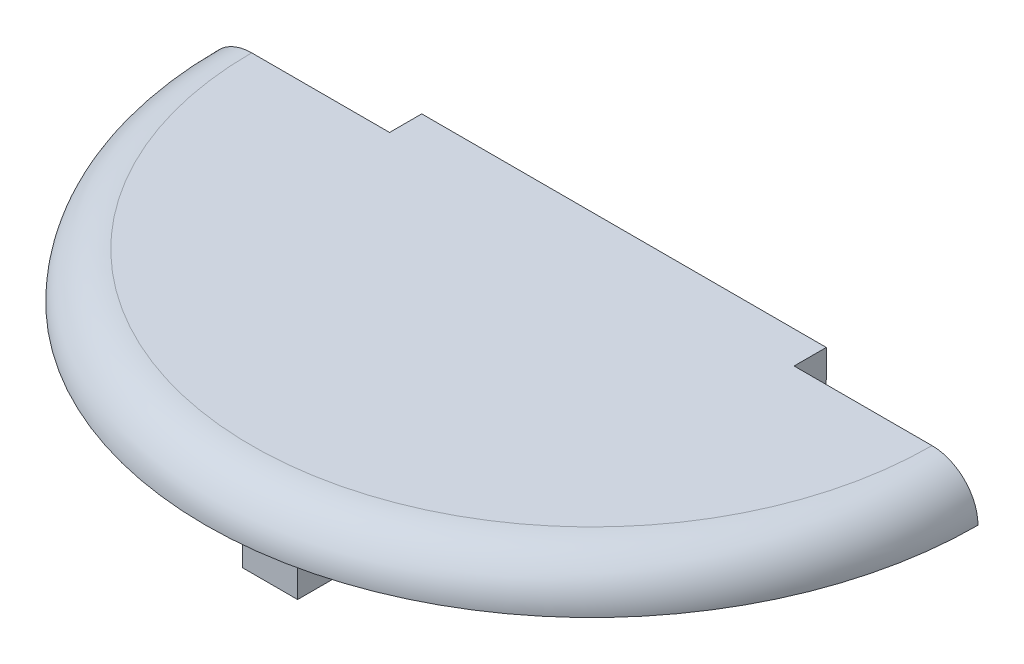
ISO-10303-21;
HEADER;
FILE_DESCRIPTION(('STEP AP214'),'2;1');
FILE_NAME('part.step','',(''),(''),'','','');
FILE_SCHEMA(('AUTOMOTIVE_DESIGN { 1 0 10303 214 1 1 1 1 }'));
ENDSEC;
DATA;
#1=APPLICATION_CONTEXT('core data for automotive mechanical design processes');
#2=APPLICATION_PROTOCOL_DEFINITION('international standard','automotive_design',2000,#1);
#3=PRODUCT_CONTEXT('',#1,'mechanical');
#4=PRODUCT('Part','Part','',(#3));
#5=PRODUCT_RELATED_PRODUCT_CATEGORY('part','',(#4));
#6=PRODUCT_DEFINITION_FORMATION('','',#4);
#7=PRODUCT_DEFINITION_CONTEXT('part definition',#1,'design');
#8=PRODUCT_DEFINITION('design','',#6,#7);
#9=PRODUCT_DEFINITION_SHAPE('','',#8);
#10=(LENGTH_UNIT() NAMED_UNIT(*) SI_UNIT(.MILLI.,.METRE.));
#11=(NAMED_UNIT(*) PLANE_ANGLE_UNIT() SI_UNIT($,.RADIAN.));
#12=(NAMED_UNIT(*) SI_UNIT($,.STERADIAN.) SOLID_ANGLE_UNIT());
#13=UNCERTAINTY_MEASURE_WITH_UNIT(LENGTH_MEASURE(1.E-05),#10,'distance_accuracy_value','');
#14=(GEOMETRIC_REPRESENTATION_CONTEXT(3) GLOBAL_UNCERTAINTY_ASSIGNED_CONTEXT((#13)) GLOBAL_UNIT_ASSIGNED_CONTEXT((#10,
#11,#12)) REPRESENTATION_CONTEXT('',''));
#15=CARTESIAN_POINT('',(0.,0.,0.));
#16=DIRECTION('',(0.,0.,1.));
#17=DIRECTION('',(1.,0.,0.));
#18=AXIS2_PLACEMENT_3D('',#15,#16,#17);
#19=CARTESIAN_POINT('',(-2.99999999999999,47.,32.));
#20=DIRECTION('',(0.,0.,1.));
#21=DIRECTION('',(1.,0.,0.));
#22=AXIS2_PLACEMENT_3D('',#19,#20,#21);
#23=PLANE('',#22);
#24=DIRECTION('',(1.,0.,0.));
#25=VECTOR('',#24,1.);
#26=CARTESIAN_POINT('',(-2.99999999999999,48.,32.));
#27=LINE('',#26,#25);
#28=CARTESIAN_POINT('',(-2.99999999999999,48.,32.));
#29=VERTEX_POINT('',#28);
#30=CARTESIAN_POINT('',(3.00000000000001,48.,32.));
#31=VERTEX_POINT('',#30);
#32=EDGE_CURVE('E254',#29,#31,#27,.T.);
#33=ORIENTED_EDGE('',*,*,#32,.F.);
#34=DIRECTION('',(0.,1.,0.));
#35=VECTOR('',#34,1.);
#36=CARTESIAN_POINT('',(-2.99999999999999,47.,32.));
#37=LINE('',#36,#35);
#38=CARTESIAN_POINT('',(-2.99999999999999,55.,32.));
#39=VERTEX_POINT('',#38);
#40=EDGE_CURVE('E238',#29,#39,#37,.T.);
#41=ORIENTED_EDGE('',*,*,#40,.T.);
#42=DIRECTION('',(1.,0.,0.));
#43=VECTOR('',#42,1.);
#44=CARTESIAN_POINT('',(-2.99999999999999,55.,32.));
#45=LINE('',#44,#43);
#46=CARTESIAN_POINT('',(3.00000000000001,55.,32.));
#47=VERTEX_POINT('',#46);
#48=EDGE_CURVE('E233',#39,#47,#45,.T.);
#49=ORIENTED_EDGE('',*,*,#48,.T.);
#50=DIRECTION('',(0.,1.,0.));
#51=VECTOR('',#50,1.);
#52=CARTESIAN_POINT('',(3.00000000000001,47.,32.));
#53=LINE('',#52,#51);
#54=EDGE_CURVE('E236',#31,#47,#53,.T.);
#55=ORIENTED_EDGE('',*,*,#54,.F.);
#56=EDGE_LOOP('',(#33,#41,#49,#55));
#57=FACE_BOUND('',#56,.T.);
#58=ADVANCED_FACE('F41',(#57),#23,.F.);
#59=CARTESIAN_POINT('',(0.,55.,0.));
#60=DIRECTION('',(0.,1.,0.));
#61=DIRECTION('',(0.,0.,1.));
#62=AXIS2_PLACEMENT_3D('',#59,#60,#61);
#63=PLANE('',#62);
#64=DIRECTION('',(0.,0.,-1.));
#65=VECTOR('',#64,1.);
#66=CARTESIAN_POINT('',(-22.,55.,0.));
#67=LINE('',#66,#65);
#68=CARTESIAN_POINT('',(-22.,55.,0.));
#69=VERTEX_POINT('',#68);
#70=CARTESIAN_POINT('',(-22.,55.,-1.5));
#71=VERTEX_POINT('',#70);
#72=EDGE_CURVE('E188',#69,#71,#67,.T.);
#73=ORIENTED_EDGE('',*,*,#72,.T.);
#74=DIRECTION('',(1.,0.,0.));
#75=VECTOR('',#74,1.);
#76=CARTESIAN_POINT('',(0.,55.,-1.5));
#77=LINE('',#76,#75);
#78=CARTESIAN_POINT('',(22.,55.,-1.5));
#79=VERTEX_POINT('',#78);
#80=EDGE_CURVE('E257',#71,#79,#77,.T.);
#81=ORIENTED_EDGE('',*,*,#80,.T.);
#82=DIRECTION('',(0.,0.,1.));
#83=VECTOR('',#82,1.);
#84=CARTESIAN_POINT('',(22.,55.,0.));
#85=LINE('',#84,#83);
#86=CARTESIAN_POINT('',(22.,55.,0.));
#87=VERTEX_POINT('',#86);
#88=EDGE_CURVE('E186',#79,#87,#85,.T.);
#89=ORIENTED_EDGE('',*,*,#88,.T.);
#90=DIRECTION('',(1.,0.,0.));
#91=VECTOR('',#90,1.);
#92=CARTESIAN_POINT('',(0.,55.,0.));
#93=LINE('',#92,#91);
#94=CARTESIAN_POINT('',(42.,55.,0.));
#95=VERTEX_POINT('',#94);
#96=EDGE_CURVE('E183',#87,#95,#93,.T.);
#97=ORIENTED_EDGE('',*,*,#96,.T.);
#98=CARTESIAN_POINT('',(0.,55.,0.));
#99=DIRECTION('',(0.,-1.,0.));
#100=DIRECTION('',(0.,0.,-1.));
#101=AXIS2_PLACEMENT_3D('',#98,#99,#100);
#102=CIRCLE('',#101,42.);
#103=CARTESIAN_POINT('',(-42.,55.,0.));
#104=VERTEX_POINT('',#103);
#105=EDGE_CURVE('E251',#95,#104,#102,.T.);
#106=ORIENTED_EDGE('',*,*,#105,.T.);
#107=DIRECTION('',(1.,0.,0.));
#108=VECTOR('',#107,1.);
#109=CARTESIAN_POINT('',(0.,55.,0.));
#110=LINE('',#109,#108);
#111=EDGE_CURVE('E179',#104,#69,#110,.T.);
#112=ORIENTED_EDGE('',*,*,#111,.T.);
#113=EDGE_LOOP('',(#73,#81,#89,#97,#106,#112));
#114=FACE_BOUND('',#113,.T.);
#115=DIRECTION('',(0.,0.,1.));
#116=VECTOR('',#115,1.);
#117=CARTESIAN_POINT('',(3.00000000000001,55.,35.));
#118=LINE('',#117,#116);
#119=CARTESIAN_POINT('',(3.00000000000001,55.,35.));
#120=VERTEX_POINT('',#119);
#121=EDGE_CURVE('E223',#47,#120,#118,.T.);
#122=ORIENTED_EDGE('',*,*,#121,.F.);
#123=ORIENTED_EDGE('',*,*,#48,.F.);
#124=DIRECTION('',(0.,0.,-1.));
#125=VECTOR('',#124,1.);
#126=CARTESIAN_POINT('',(-2.99999999999999,55.,35.));
#127=LINE('',#126,#125);
#128=CARTESIAN_POINT('',(-2.99999999999999,55.,35.));
#129=VERTEX_POINT('',#128);
#130=EDGE_CURVE('E230',#129,#39,#127,.T.);
#131=ORIENTED_EDGE('',*,*,#130,.F.);
#132=DIRECTION('',(-1.,0.,0.));
#133=VECTOR('',#132,1.);
#134=CARTESIAN_POINT('',(-2.99999999999999,55.,35.));
#135=LINE('',#134,#133);
#136=EDGE_CURVE('E227',#120,#129,#135,.T.);
#137=ORIENTED_EDGE('',*,*,#136,.F.);
#138=EDGE_LOOP('',(#122,#123,#131,#137));
#139=FACE_BOUND('',#138,.T.);
#140=ADVANCED_FACE('F294',(#114,#139),#63,.F.);
#141=CARTESIAN_POINT('',(37.,60.,0.));
#142=DIRECTION('',(0.,1.,0.));
#143=DIRECTION('',(0.,0.,1.));
#144=AXIS2_PLACEMENT_3D('',#141,#142,#143);
#145=PLANE('',#144);
#146=DIRECTION('',(1.,0.,0.));
#147=VECTOR('',#146,1.);
#148=CARTESIAN_POINT('',(-22.,60.,-3.5));
#149=LINE('',#148,#147);
#150=CARTESIAN_POINT('',(-22.,60.,-3.5));
#151=VERTEX_POINT('',#150);
#152=CARTESIAN_POINT('',(22.,60.,-3.5));
#153=VERTEX_POINT('',#152);
#154=EDGE_CURVE('E144',#151,#153,#149,.T.);
#155=ORIENTED_EDGE('',*,*,#154,.F.);
#156=DIRECTION('',(0.,0.,-1.));
#157=VECTOR('',#156,1.);
#158=CARTESIAN_POINT('',(-22.,60.,-7.));
#159=LINE('',#158,#157);
#160=CARTESIAN_POINT('',(-22.,60.,0.));
#161=VERTEX_POINT('',#160);
#162=EDGE_CURVE('E157',#161,#151,#159,.T.);
#163=ORIENTED_EDGE('',*,*,#162,.F.);
#164=DIRECTION('',(1.,0.,0.));
#165=VECTOR('',#164,1.);
#166=CARTESIAN_POINT('',(-42.,60.,0.));
#167=LINE('',#166,#165);
#168=CARTESIAN_POINT('',(-37.,60.,0.));
#169=VERTEX_POINT('',#168);
#170=EDGE_CURVE('E165',#169,#161,#167,.T.);
#171=ORIENTED_EDGE('',*,*,#170,.F.);
#172=CARTESIAN_POINT('',(0.,60.,0.));
#173=DIRECTION('',(0.,-1.,0.));
#174=DIRECTION('',(0.,0.,-1.));
#175=AXIS2_PLACEMENT_3D('',#172,#173,#174);
#176=CIRCLE('',#175,37.);
#177=CARTESIAN_POINT('',(37.,60.,0.));
#178=VERTEX_POINT('',#177);
#179=EDGE_CURVE('E248',#178,#169,#176,.T.);
#180=ORIENTED_EDGE('',*,*,#179,.F.);
#181=DIRECTION('',(1.,0.,0.));
#182=VECTOR('',#181,1.);
#183=CARTESIAN_POINT('',(42.,60.,0.));
#184=LINE('',#183,#182);
#185=CARTESIAN_POINT('',(22.,60.,0.));
#186=VERTEX_POINT('',#185);
#187=EDGE_CURVE('E174',#186,#178,#184,.T.);
#188=ORIENTED_EDGE('',*,*,#187,.F.);
#189=DIRECTION('',(0.,0.,1.));
#190=VECTOR('',#189,1.);
#191=CARTESIAN_POINT('',(22.,60.,-7.));
#192=LINE('',#191,#190);
#193=EDGE_CURVE('E159',#153,#186,#192,.T.);
#194=ORIENTED_EDGE('',*,*,#193,.F.);
#195=EDGE_LOOP('',(#155,#163,#171,#180,#188,#194));
#196=FACE_BOUND('',#195,.T.);
#197=ADVANCED_FACE('F155',(#196),#145,.T.);
#198=CARTESIAN_POINT('',(0.,55.,0.));
#199=DIRECTION('',(0.,-1.,0.));
#200=DIRECTION('',(0.,0.,-1.));
#201=AXIS2_PLACEMENT_3D('',#198,#199,#200);
#202=TOROIDAL_SURFACE('',#201,37.,5.);
#203=CARTESIAN_POINT('',(-37.,55.,0.));
#204=DIRECTION('',(0.,0.,1.));
#205=DIRECTION('',(1.,0.,0.));
#206=AXIS2_PLACEMENT_3D('',#203,#204,#205);
#207=CIRCLE('',#206,5.);
#208=EDGE_CURVE('E246',#104,#169,#207,.F.);
#209=ORIENTED_EDGE('',*,*,#208,.F.);
#210=ORIENTED_EDGE('',*,*,#105,.F.);
#211=CARTESIAN_POINT('',(37.,55.,0.));
#212=DIRECTION('',(0.,0.,1.));
#213=DIRECTION('',(1.,0.,0.));
#214=AXIS2_PLACEMENT_3D('',#211,#212,#213);
#215=CIRCLE('',#214,5.);
#216=EDGE_CURVE('E244',#178,#95,#215,.F.);
#217=ORIENTED_EDGE('',*,*,#216,.F.);
#218=ORIENTED_EDGE('',*,*,#179,.T.);
#219=EDGE_LOOP('',(#209,#210,#217,#218));
#220=FACE_BOUND('',#219,.T.);
#221=ADVANCED_FACE('F306',(#220),#202,.T.);
#222=CARTESIAN_POINT('',(3.00000000000001,47.,35.));
#223=DIRECTION('',(-1.,0.,0.));
#224=DIRECTION('',(0.,0.,1.));
#225=AXIS2_PLACEMENT_3D('',#222,#223,#224);
#226=PLANE('',#225);
#227=DIRECTION('',(0.,0.,1.));
#228=VECTOR('',#227,1.);
#229=CARTESIAN_POINT('',(3.00000000000001,48.,35.));
#230=LINE('',#229,#228);
#231=CARTESIAN_POINT('',(3.00000000000001,48.,29.));
#232=VERTEX_POINT('',#231);
#233=EDGE_CURVE('E217',#232,#31,#230,.T.);
#234=ORIENTED_EDGE('',*,*,#233,.T.);
#235=ORIENTED_EDGE('',*,*,#54,.T.);
#236=ORIENTED_EDGE('',*,*,#121,.T.);
#237=DIRECTION('',(0.,1.,0.));
#238=VECTOR('',#237,1.);
#239=CARTESIAN_POINT('',(3.00000000000001,47.,35.));
#240=LINE('',#239,#238);
#241=CARTESIAN_POINT('',(3.00000000000001,46.,35.));
#242=VERTEX_POINT('',#241);
#243=EDGE_CURVE('E242',#242,#120,#240,.T.);
#244=ORIENTED_EDGE('',*,*,#243,.F.);
#245=DIRECTION('',(0.,0.,1.));
#246=VECTOR('',#245,1.);
#247=CARTESIAN_POINT('',(3.00000000000001,46.,35.));
#248=LINE('',#247,#246);
#249=CARTESIAN_POINT('',(3.00000000000001,46.,29.));
#250=VERTEX_POINT('',#249);
#251=EDGE_CURVE('E206',#250,#242,#248,.T.);
#252=ORIENTED_EDGE('',*,*,#251,.F.);
#253=DIRECTION('',(0.,-1.,0.));
#254=VECTOR('',#253,1.);
#255=CARTESIAN_POINT('',(3.00000000000001,48.,29.));
#256=LINE('',#255,#254);
#257=EDGE_CURVE('E221',#232,#250,#256,.T.);
#258=ORIENTED_EDGE('',*,*,#257,.F.);
#259=EDGE_LOOP('',(#234,#235,#236,#244,#252,#258));
#260=FACE_BOUND('',#259,.T.);
#261=ADVANCED_FACE('F302',(#260),#226,.F.);
#262=CARTESIAN_POINT('',(-2.99999999999999,47.,35.));
#263=DIRECTION('',(0.,0.,-1.));
#264=DIRECTION('',(-1.,0.,0.));
#265=AXIS2_PLACEMENT_3D('',#262,#263,#264);
#266=PLANE('',#265);
#267=ORIENTED_EDGE('',*,*,#243,.T.);
#268=ORIENTED_EDGE('',*,*,#136,.T.);
#269=DIRECTION('',(0.,1.,0.));
#270=VECTOR('',#269,1.);
#271=CARTESIAN_POINT('',(-2.99999999999999,47.,35.));
#272=LINE('',#271,#270);
#273=CARTESIAN_POINT('',(-2.99999999999999,46.,35.));
#274=VERTEX_POINT('',#273);
#275=EDGE_CURVE('E240',#274,#129,#272,.T.);
#276=ORIENTED_EDGE('',*,*,#275,.F.);
#277=DIRECTION('',(-1.,0.,0.));
#278=VECTOR('',#277,1.);
#279=CARTESIAN_POINT('',(-2.99999999999999,46.,35.));
#280=LINE('',#279,#278);
#281=EDGE_CURVE('E209',#242,#274,#280,.T.);
#282=ORIENTED_EDGE('',*,*,#281,.F.);
#283=EDGE_LOOP('',(#267,#268,#276,#282));
#284=FACE_BOUND('',#283,.T.);
#285=ADVANCED_FACE('F298',(#284),#266,.F.);
#286=CARTESIAN_POINT('',(-2.99999999999999,47.,35.));
#287=DIRECTION('',(1.,0.,0.));
#288=DIRECTION('',(0.,0.,-1.));
#289=AXIS2_PLACEMENT_3D('',#286,#287,#288);
#290=PLANE('',#289);
#291=ORIENTED_EDGE('',*,*,#275,.T.);
#292=ORIENTED_EDGE('',*,*,#130,.T.);
#293=ORIENTED_EDGE('',*,*,#40,.F.);
#294=DIRECTION('',(0.,0.,-1.));
#295=VECTOR('',#294,1.);
#296=CARTESIAN_POINT('',(-2.99999999999999,48.,35.));
#297=LINE('',#296,#295);
#298=CARTESIAN_POINT('',(-2.99999999999999,48.,29.));
#299=VERTEX_POINT('',#298);
#300=EDGE_CURVE('E212',#29,#299,#297,.T.);
#301=ORIENTED_EDGE('',*,*,#300,.T.);
#302=DIRECTION('',(0.,-1.,0.));
#303=VECTOR('',#302,1.);
#304=CARTESIAN_POINT('',(-2.99999999999999,48.,29.));
#305=LINE('',#304,#303);
#306=CARTESIAN_POINT('',(-2.99999999999999,46.,29.));
#307=VERTEX_POINT('',#306);
#308=EDGE_CURVE('E220',#299,#307,#305,.T.);
#309=ORIENTED_EDGE('',*,*,#308,.T.);
#310=DIRECTION('',(0.,0.,-1.));
#311=VECTOR('',#310,1.);
#312=CARTESIAN_POINT('',(-2.99999999999999,46.,35.));
#313=LINE('',#312,#311);
#314=EDGE_CURVE('E200',#274,#307,#313,.T.);
#315=ORIENTED_EDGE('',*,*,#314,.F.);
#316=EDGE_LOOP('',(#291,#292,#293,#301,#309,#315));
#317=FACE_BOUND('',#316,.T.);
#318=ADVANCED_FACE('F287',(#317),#290,.F.);
#319=CARTESIAN_POINT('',(0.,48.,0.));
#320=DIRECTION('',(0.,-1.,0.));
#321=DIRECTION('',(0.,0.,-1.));
#322=AXIS2_PLACEMENT_3D('',#319,#320,#321);
#323=PLANE('',#322);
#324=ORIENTED_EDGE('',*,*,#300,.F.);
#325=ORIENTED_EDGE('',*,*,#32,.T.);
#326=ORIENTED_EDGE('',*,*,#233,.F.);
#327=DIRECTION('',(1.,0.,0.));
#328=VECTOR('',#327,1.);
#329=CARTESIAN_POINT('',(-2.99999999999999,48.,29.));
#330=LINE('',#329,#328);
#331=EDGE_CURVE('E214',#299,#232,#330,.T.);
#332=ORIENTED_EDGE('',*,*,#331,.F.);
#333=EDGE_LOOP('',(#324,#325,#326,#332));
#334=FACE_BOUND('',#333,.T.);
#335=ADVANCED_FACE('F284',(#334),#323,.F.);
#336=CARTESIAN_POINT('',(-2.99999999999999,48.,29.));
#337=DIRECTION('',(0.,0.,-1.));
#338=DIRECTION('',(-1.,0.,0.));
#339=AXIS2_PLACEMENT_3D('',#336,#337,#338);
#340=PLANE('',#339);
#341=ORIENTED_EDGE('',*,*,#257,.T.);
#342=DIRECTION('',(1.,0.,0.));
#343=VECTOR('',#342,1.);
#344=CARTESIAN_POINT('',(-2.99999999999999,46.,29.));
#345=LINE('',#344,#343);
#346=EDGE_CURVE('E203',#307,#250,#345,.T.);
#347=ORIENTED_EDGE('',*,*,#346,.F.);
#348=ORIENTED_EDGE('',*,*,#308,.F.);
#349=ORIENTED_EDGE('',*,*,#331,.T.);
#350=EDGE_LOOP('',(#341,#347,#348,#349));
#351=FACE_BOUND('',#350,.T.);
#352=ADVANCED_FACE('F282',(#351),#340,.T.);
#353=CARTESIAN_POINT('',(0.,46.,0.));
#354=DIRECTION('',(0.,-1.,0.));
#355=DIRECTION('',(0.,0.,-1.));
#356=AXIS2_PLACEMENT_3D('',#353,#354,#355);
#357=PLANE('',#356);
#358=ORIENTED_EDGE('',*,*,#314,.T.);
#359=ORIENTED_EDGE('',*,*,#346,.T.);
#360=ORIENTED_EDGE('',*,*,#251,.T.);
#361=ORIENTED_EDGE('',*,*,#281,.T.);
#362=EDGE_LOOP('',(#358,#359,#360,#361));
#363=FACE_BOUND('',#362,.T.);
#364=ADVANCED_FACE('F279',(#363),#357,.T.);
#365=CARTESIAN_POINT('',(-22.,53.,-7.));
#366=DIRECTION('',(1.,0.,0.));
#367=DIRECTION('',(0.,0.,-1.));
#368=AXIS2_PLACEMENT_3D('',#365,#366,#367);
#369=PLANE('',#368);
#370=DIRECTION('',(0.,1.,0.));
#371=VECTOR('',#370,1.);
#372=CARTESIAN_POINT('',(-22.,55.,-3.5));
#373=LINE('',#372,#371);
#374=CARTESIAN_POINT('',(-22.,57.,-3.5));
#375=VERTEX_POINT('',#374);
#376=EDGE_CURVE('E141',#375,#151,#373,.T.);
#377=ORIENTED_EDGE('',*,*,#376,.F.);
#378=CARTESIAN_POINT('',(-22.,57.,-1.5));
#379=DIRECTION('',(1.,0.,0.));
#380=DIRECTION('',(0.,0.,-1.));
#381=AXIS2_PLACEMENT_3D('',#378,#379,#380);
#382=CIRCLE('',#381,2.);
#383=EDGE_CURVE('E12',#375,#71,#382,.F.);
#384=ORIENTED_EDGE('',*,*,#383,.T.);
#385=ORIENTED_EDGE('',*,*,#72,.F.);
#386=DIRECTION('',(0.,1.,0.));
#387=VECTOR('',#386,1.);
#388=CARTESIAN_POINT('',(-22.,53.,0.));
#389=LINE('',#388,#387);
#390=EDGE_CURVE('E163',#69,#161,#389,.T.);
#391=ORIENTED_EDGE('',*,*,#390,.T.);
#392=ORIENTED_EDGE('',*,*,#162,.T.);
#393=EDGE_LOOP('',(#377,#384,#385,#391,#392));
#394=FACE_BOUND('',#393,.T.);
#395=ADVANCED_FACE('F161',(#394),#369,.F.);
#396=CARTESIAN_POINT('',(-42.,53.,0.));
#397=DIRECTION('',(0.,0.,1.));
#398=DIRECTION('',(1.,0.,0.));
#399=AXIS2_PLACEMENT_3D('',#396,#397,#398);
#400=PLANE('',#399);
#401=CARTESIAN_POINT('',(-30.,57.5,0.));
#402=DIRECTION('',(0.,0.,1.));
#403=DIRECTION('',(1.,0.,0.));
#404=AXIS2_PLACEMENT_3D('',#401,#402,#403);
#405=CIRCLE('',#404,1.5);
#406=CARTESIAN_POINT('',(-28.5,57.5,0.));
#407=VERTEX_POINT('',#406);
#408=EDGE_CURVE('E167',#407,#407,#405,.F.);
#409=ORIENTED_EDGE('',*,*,#408,.F.);
#410=EDGE_LOOP('',(#409));
#411=FACE_BOUND('',#410,.T.);
#412=ORIENTED_EDGE('',*,*,#208,.T.);
#413=ORIENTED_EDGE('',*,*,#170,.T.);
#414=ORIENTED_EDGE('',*,*,#390,.F.);
#415=ORIENTED_EDGE('',*,*,#111,.F.);
#416=EDGE_LOOP('',(#412,#413,#414,#415));
#417=FACE_BOUND('',#416,.T.);
#418=ADVANCED_FACE('F355',(#411,#417),#400,.F.);
#419=CARTESIAN_POINT('',(22.,53.,-7.));
#420=DIRECTION('',(-1.,0.,0.));
#421=DIRECTION('',(0.,0.,1.));
#422=AXIS2_PLACEMENT_3D('',#419,#420,#421);
#423=PLANE('',#422);
#424=ORIENTED_EDGE('',*,*,#88,.F.);
#425=CARTESIAN_POINT('',(22.,57.,-1.5));
#426=DIRECTION('',(-1.,0.,0.));
#427=DIRECTION('',(0.,0.,1.));
#428=AXIS2_PLACEMENT_3D('',#425,#426,#427);
#429=CIRCLE('',#428,2.);
#430=CARTESIAN_POINT('',(22.,57.,-3.5));
#431=VERTEX_POINT('',#430);
#432=EDGE_CURVE('E264',#79,#431,#429,.F.);
#433=ORIENTED_EDGE('',*,*,#432,.T.);
#434=DIRECTION('',(0.,1.,0.));
#435=VECTOR('',#434,1.);
#436=CARTESIAN_POINT('',(22.,55.,-3.5));
#437=LINE('',#436,#435);
#438=EDGE_CURVE('E151',#431,#153,#437,.T.);
#439=ORIENTED_EDGE('',*,*,#438,.T.);
#440=ORIENTED_EDGE('',*,*,#193,.T.);
#441=DIRECTION('',(0.,1.,0.));
#442=VECTOR('',#441,1.);
#443=CARTESIAN_POINT('',(22.,53.,0.));
#444=LINE('',#443,#442);
#445=EDGE_CURVE('E169',#87,#186,#444,.T.);
#446=ORIENTED_EDGE('',*,*,#445,.F.);
#447=EDGE_LOOP('',(#424,#433,#439,#440,#446));
#448=FACE_BOUND('',#447,.T.);
#449=ADVANCED_FACE('F334',(#448),#423,.F.);
#450=CARTESIAN_POINT('',(42.,53.,0.));
#451=DIRECTION('',(0.,0.,1.));
#452=DIRECTION('',(1.,0.,0.));
#453=AXIS2_PLACEMENT_3D('',#450,#451,#452);
#454=PLANE('',#453);
#455=CARTESIAN_POINT('',(30.,57.5,0.));
#456=DIRECTION('',(0.,0.,1.));
#457=DIRECTION('',(1.,0.,0.));
#458=AXIS2_PLACEMENT_3D('',#455,#456,#457);
#459=CIRCLE('',#458,1.5);
#460=CARTESIAN_POINT('',(31.5,57.5,0.));
#461=VERTEX_POINT('',#460);
#462=EDGE_CURVE('E182',#461,#461,#459,.F.);
#463=ORIENTED_EDGE('',*,*,#462,.F.);
#464=EDGE_LOOP('',(#463));
#465=FACE_BOUND('',#464,.T.);
#466=ORIENTED_EDGE('',*,*,#445,.T.);
#467=ORIENTED_EDGE('',*,*,#187,.T.);
#468=ORIENTED_EDGE('',*,*,#216,.T.);
#469=ORIENTED_EDGE('',*,*,#96,.F.);
#470=EDGE_LOOP('',(#466,#467,#468,#469));
#471=FACE_BOUND('',#470,.T.);
#472=ADVANCED_FACE('F359',(#465,#471),#454,.F.);
#473=CARTESIAN_POINT('',(-30.,57.5,13.));
#474=DIRECTION('',(0.,0.,-1.));
#475=DIRECTION('',(-1.,0.,0.));
#476=AXIS2_PLACEMENT_3D('',#473,#474,#475);
#477=PLANE('',#476);
#478=CARTESIAN_POINT('',(-30.,57.5,13.));
#479=DIRECTION('',(0.,0.,-1.));
#480=DIRECTION('',(-1.,0.,0.));
#481=AXIS2_PLACEMENT_3D('',#478,#479,#480);
#482=CIRCLE('',#481,1.5);
#483=CARTESIAN_POINT('',(-31.5,57.5,13.));
#484=VERTEX_POINT('',#483);
#485=EDGE_CURVE('E191',#484,#484,#482,.T.);
#486=ORIENTED_EDGE('',*,*,#485,.T.);
#487=EDGE_LOOP('',(#486));
#488=FACE_BOUND('',#487,.T.);
#489=ADVANCED_FACE('F362',(#488),#477,.T.);
#490=CARTESIAN_POINT('',(-30.,57.5,13.));
#491=DIRECTION('',(0.,0.,-1.));
#492=DIRECTION('',(-1.,0.,0.));
#493=AXIS2_PLACEMENT_3D('',#490,#491,#492);
#494=CYLINDRICAL_SURFACE('',#493,1.5);
#495=ORIENTED_EDGE('',*,*,#408,.T.);
#496=EDGE_LOOP('',(#495));
#497=FACE_BOUND('',#496,.T.);
#498=ORIENTED_EDGE('',*,*,#485,.F.);
#499=EDGE_LOOP('',(#498));
#500=FACE_BOUND('',#499,.T.);
#501=ADVANCED_FACE('F367',(#497,#500),#494,.F.);
#502=CARTESIAN_POINT('',(30.,57.5,13.));
#503=DIRECTION('',(0.,0.,-1.));
#504=DIRECTION('',(-1.,0.,0.));
#505=AXIS2_PLACEMENT_3D('',#502,#503,#504);
#506=PLANE('',#505);
#507=CARTESIAN_POINT('',(30.,57.5,13.));
#508=DIRECTION('',(0.,0.,-1.));
#509=DIRECTION('',(-1.,0.,0.));
#510=AXIS2_PLACEMENT_3D('',#507,#508,#509);
#511=CIRCLE('',#510,1.5);
#512=CARTESIAN_POINT('',(28.5,57.5,13.));
#513=VERTEX_POINT('',#512);
#514=EDGE_CURVE('E192',#513,#513,#511,.T.);
#515=ORIENTED_EDGE('',*,*,#514,.T.);
#516=EDGE_LOOP('',(#515));
#517=FACE_BOUND('',#516,.T.);
#518=ADVANCED_FACE('F349',(#517),#506,.T.);
#519=CARTESIAN_POINT('',(30.,57.5,13.));
#520=DIRECTION('',(0.,0.,-1.));
#521=DIRECTION('',(-1.,0.,0.));
#522=AXIS2_PLACEMENT_3D('',#519,#520,#521);
#523=CYLINDRICAL_SURFACE('',#522,1.5);
#524=ORIENTED_EDGE('',*,*,#462,.T.);
#525=EDGE_LOOP('',(#524));
#526=FACE_BOUND('',#525,.T.);
#527=ORIENTED_EDGE('',*,*,#514,.F.);
#528=EDGE_LOOP('',(#527));
#529=FACE_BOUND('',#528,.T.);
#530=ADVANCED_FACE('F344',(#526,#529),#523,.F.);
#531=CARTESIAN_POINT('',(-22.,55.,-3.5));
#532=DIRECTION('',(0.,0.,1.));
#533=DIRECTION('',(1.,0.,0.));
#534=AXIS2_PLACEMENT_3D('',#531,#532,#533);
#535=PLANE('',#534);
#536=ORIENTED_EDGE('',*,*,#438,.F.);
#537=DIRECTION('',(1.,0.,0.));
#538=VECTOR('',#537,1.);
#539=CARTESIAN_POINT('',(-22.,57.,-3.5));
#540=LINE('',#539,#538);
#541=CARTESIAN_POINT('',(1.4142135623731,57.,-3.5));
#542=VERTEX_POINT('',#541);
#543=EDGE_CURVE('E62',#431,#542,#540,.F.);
#544=ORIENTED_EDGE('',*,*,#543,.T.);
#545=CARTESIAN_POINT('',(0.,57.5,-3.5));
#546=DIRECTION('',(0.,0.,1.));
#547=DIRECTION('',(1.,0.,0.));
#548=AXIS2_PLACEMENT_3D('',#545,#546,#547);
#549=CIRCLE('',#548,1.5);
#550=CARTESIAN_POINT('',(-1.4142135623731,57.,-3.5));
#551=VERTEX_POINT('',#550);
#552=EDGE_CURVE('E175',#551,#542,#549,.F.);
#553=ORIENTED_EDGE('',*,*,#552,.F.);
#554=DIRECTION('',(1.,0.,0.));
#555=VECTOR('',#554,1.);
#556=CARTESIAN_POINT('',(-22.,57.,-3.5));
#557=LINE('',#556,#555);
#558=EDGE_CURVE('E147',#551,#375,#557,.F.);
#559=ORIENTED_EDGE('',*,*,#558,.T.);
#560=ORIENTED_EDGE('',*,*,#376,.T.);
#561=ORIENTED_EDGE('',*,*,#154,.T.);
#562=EDGE_LOOP('',(#536,#544,#553,#559,#560,#561));
#563=FACE_BOUND('',#562,.T.);
#564=ADVANCED_FACE('F143',(#563),#535,.F.);
#565=CARTESIAN_POINT('',(0.,57.5,13.));
#566=DIRECTION('',(0.,0.,-1.));
#567=DIRECTION('',(-1.,0.,0.));
#568=AXIS2_PLACEMENT_3D('',#565,#566,#567);
#569=PLANE('',#568);
#570=CARTESIAN_POINT('',(0.,57.5,13.));
#571=DIRECTION('',(0.,0.,-1.));
#572=DIRECTION('',(-1.,0.,0.));
#573=AXIS2_PLACEMENT_3D('',#570,#571,#572);
#574=CIRCLE('',#573,1.5);
#575=CARTESIAN_POINT('',(-1.5,57.5,13.));
#576=VERTEX_POINT('',#575);
#577=EDGE_CURVE('E195',#576,#576,#574,.T.);
#578=ORIENTED_EDGE('',*,*,#577,.T.);
#579=EDGE_LOOP('',(#578));
#580=FACE_BOUND('',#579,.T.);
#581=ADVANCED_FACE('F277',(#580),#569,.T.);
#582=CARTESIAN_POINT('',(0.,57.5,13.));
#583=DIRECTION('',(0.,0.,-1.));
#584=DIRECTION('',(-1.,0.,0.));
#585=AXIS2_PLACEMENT_3D('',#582,#583,#584);
#586=CYLINDRICAL_SURFACE('',#585,1.5);
#587=ORIENTED_EDGE('',*,*,#552,.T.);
#588=CARTESIAN_POINT('',(1.4142135623731,57.,-3.5));
#589=CARTESIAN_POINT('',(1.40097388923635,56.9625420183511,-3.50000425427285));
#590=CARTESIAN_POINT('',(1.38624894151197,56.9256416052035,-3.49894716578043));
#591=CARTESIAN_POINT('',(1.35398271369799,56.8532398584144,-3.49493648310508));
#592=CARTESIAN_POINT('',(1.33644410598799,56.8177372366262,-3.49198468059268));
#593=CARTESIAN_POINT('',(1.2800599018386,56.7141298142748,-3.48067529321354));
#594=CARTESIAN_POINT('',(1.23725747018488,56.6483972834856,-3.46985736542155));
#595=CARTESIAN_POINT('',(1.14270019343597,56.5251850552791,-3.4438408593464));
#596=CARTESIAN_POINT('',(1.09097476848163,56.4676793383985,-3.42865657105467));
#597=CARTESIAN_POINT('',(0.97959224113728,56.3614332203772,-3.39613396086694));
#598=CARTESIAN_POINT('',(0.919918777561211,56.3127114015186,-3.37879120067876));
#599=CARTESIAN_POINT('',(0.787771974869047,56.2207432819381,-3.34266891165827));
#600=CARTESIAN_POINT('',(0.714621083358711,56.1784580554296,-3.32390955783459));
#601=CARTESIAN_POINT('',(0.561620501730957,56.1065451806078,-3.28978468626863));
#602=CARTESIAN_POINT('',(0.481775322452776,56.0769090895972,-3.27441690812946));
#603=CARTESIAN_POINT('',(0.317918567740806,56.0316396566997,-3.25012731556094));
#604=CARTESIAN_POINT('',(0.233946603573637,56.0158932924402,-3.24115358931953));
#605=CARTESIAN_POINT('',(0.0641125456825648,55.998949964518,-3.23147548338831));
#606=CARTESIAN_POINT('',(-0.0217474096477873,55.9977373121146,-3.23076218682081));
#607=CARTESIAN_POINT('',(-0.181284890556875,56.0091223737518,-3.23729163307443));
#608=CARTESIAN_POINT('',(-0.255135786145512,56.0200013744653,-3.24354447192533));
#609=CARTESIAN_POINT('',(-0.399812728452234,56.0523643508618,-3.2613415604065));
#610=CARTESIAN_POINT('',(-0.470637334956178,56.0738533160861,-3.27288829941322));
#611=CARTESIAN_POINT('',(-0.609961847769087,56.1275200128162,-3.29991768497195));
#612=CARTESIAN_POINT('',(-0.678315481223649,56.1600169072471,-3.31551415704041));
#613=CARTESIAN_POINT('',(-0.80915393348824,56.2347125213149,-3.34824161944052));
#614=CARTESIAN_POINT('',(-0.871632980383434,56.2769206449966,-3.3653740873023));
#615=CARTESIAN_POINT('',(-0.997397555345237,56.3764176964208,-3.40112878725472));
#616=CARTESIAN_POINT('',(-1.05972965105423,56.43495444285,-3.41965469300766));
#617=CARTESIAN_POINT('',(-1.17391994011939,56.5623449780605,-3.45263037181628));
#618=CARTESIAN_POINT('',(-1.22580092541402,56.6311757331108,-3.46708904268836));
#619=CARTESIAN_POINT('',(-1.30048427389812,56.7505251981946,-3.48492929460295));
#620=CARTESIAN_POINT('',(-1.32695975412491,56.7984547120606,-3.49042928310565));
#621=CARTESIAN_POINT('',(-1.37465755721004,56.8972201883336,-3.49797720494047));
#622=CARTESIAN_POINT('',(-1.39586993508872,56.9480614329664,-3.50001864488531));
#623=CARTESIAN_POINT('',(-1.4142135623731,57.,-3.5));
#624=B_SPLINE_CURVE_WITH_KNOTS('',3,(#588,#589,#590,#591,#592,#593,#594,#595,#596,#597,#598,
#599,#600,#601,#602,#603,#604,#605,#606,#607,#608,#609,#610,#611,#612,#613,#614,#615,#616,#617,
#618,#619,#620,#621,#622,#623),.UNSPECIFIED.,.F.,.F.,(4,2,2,2,2,2,2,2,2,2,2,2,2,2,2,2,2,4),(0.,
0.119087251812839,0.238062058466244,0.474354010394472,0.709881272489637,0.945901089451948,
1.20436177709154,1.46264968369296,1.71881594974819,1.97470566645396,2.19839384187536,
2.42218731133175,2.65312120153516,2.88427966904885,3.14552433683025,3.40619295899263,
3.57088162049618,3.73587914190753),.UNSPECIFIED.);
#625=EDGE_CURVE('E50',#542,#551,#624,.T.);
#626=ORIENTED_EDGE('',*,*,#625,.T.);
#627=EDGE_LOOP('',(#587,#626));
#628=FACE_BOUND('',#627,.T.);
#629=ORIENTED_EDGE('',*,*,#577,.F.);
#630=EDGE_LOOP('',(#629));
#631=FACE_BOUND('',#630,.T.);
#632=ADVANCED_FACE('F272',(#628,#631),#586,.F.);
#633=CARTESIAN_POINT('',(0.,57.,-1.5));
#634=DIRECTION('',(1.,0.,0.));
#635=DIRECTION('',(0.,0.,-1.));
#636=AXIS2_PLACEMENT_3D('',#633,#634,#635);
#637=CYLINDRICAL_SURFACE('',#636,2.);
#638=ORIENTED_EDGE('',*,*,#625,.F.);
#639=ORIENTED_EDGE('',*,*,#543,.F.);
#640=ORIENTED_EDGE('',*,*,#432,.F.);
#641=ORIENTED_EDGE('',*,*,#80,.F.);
#642=ORIENTED_EDGE('',*,*,#383,.F.);
#643=ORIENTED_EDGE('',*,*,#558,.F.);
#644=EDGE_LOOP('',(#638,#639,#640,#641,#642,#643));
#645=FACE_BOUND('',#644,.T.);
#646=ADVANCED_FACE('F43',(#645),#637,.T.);
#647=CLOSED_SHELL('',(#58,#140,#197,#221,#261,#285,#318,#335,#352,#364,#395,#418,#449,#472,#489,
#501,#518,#530,#564,#581,#632,#646));
#648=MANIFOLD_SOLID_BREP('B2',#647);
#649=ADVANCED_BREP_SHAPE_REPRESENTATION('',(#18,#648),#14);
#650=SHAPE_DEFINITION_REPRESENTATION(#9,#649);
ENDSEC;
END-ISO-10303-21;
